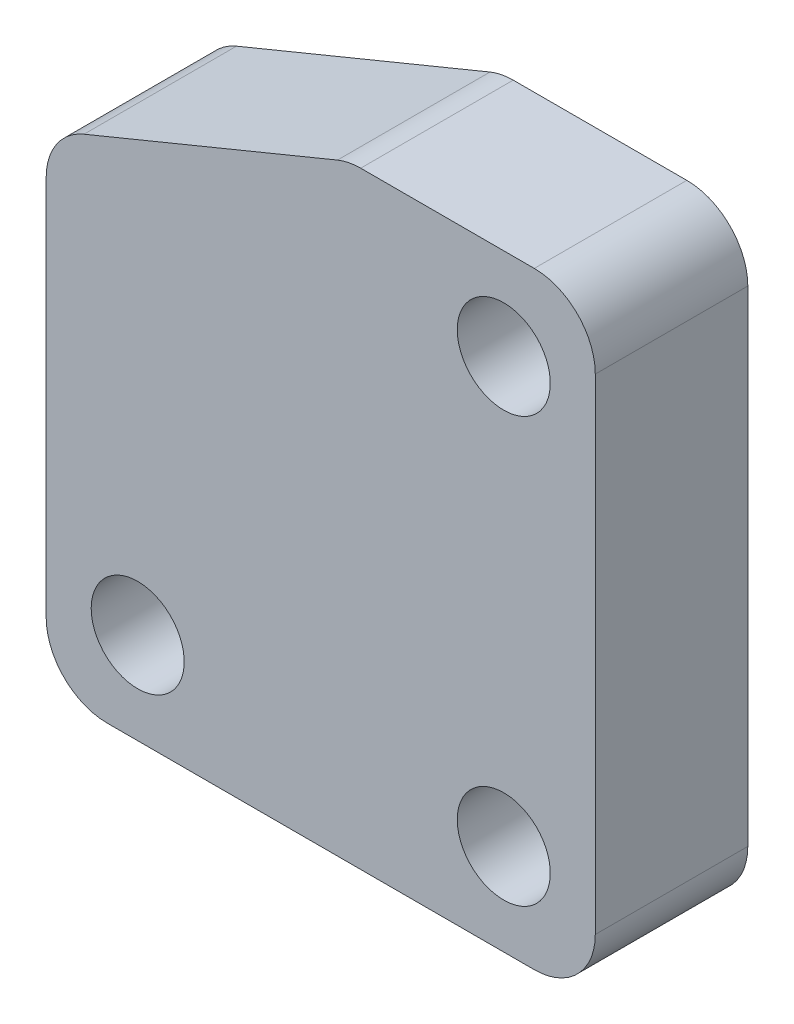
ISO-10303-21;
HEADER;
FILE_DESCRIPTION(('STEP AP214'),'2;1');
FILE_NAME('part.step','',(''),(''),'','','');
FILE_SCHEMA(('AUTOMOTIVE_DESIGN { 1 0 10303 214 1 1 1 1 }'));
ENDSEC;
DATA;
#1=APPLICATION_CONTEXT('core data for automotive mechanical design processes');
#2=APPLICATION_PROTOCOL_DEFINITION('international standard','automotive_design',2000,#1);
#3=PRODUCT_CONTEXT('',#1,'mechanical');
#4=PRODUCT('Part','Part','',(#3));
#5=PRODUCT_RELATED_PRODUCT_CATEGORY('part','',(#4));
#6=PRODUCT_DEFINITION_FORMATION('','',#4);
#7=PRODUCT_DEFINITION_CONTEXT('part definition',#1,'design');
#8=PRODUCT_DEFINITION('design','',#6,#7);
#9=PRODUCT_DEFINITION_SHAPE('','',#8);
#10=(LENGTH_UNIT() NAMED_UNIT(*) SI_UNIT(.MILLI.,.METRE.));
#11=(NAMED_UNIT(*) PLANE_ANGLE_UNIT() SI_UNIT($,.RADIAN.));
#12=(NAMED_UNIT(*) SI_UNIT($,.STERADIAN.) SOLID_ANGLE_UNIT());
#13=UNCERTAINTY_MEASURE_WITH_UNIT(LENGTH_MEASURE(1.E-05),#10,'distance_accuracy_value','');
#14=(GEOMETRIC_REPRESENTATION_CONTEXT(3) GLOBAL_UNCERTAINTY_ASSIGNED_CONTEXT((#13)) GLOBAL_UNIT_ASSIGNED_CONTEXT((#10,
#11,#12)) REPRESENTATION_CONTEXT('',''));
#15=CARTESIAN_POINT('',(0.,0.,0.));
#16=DIRECTION('',(0.,0.,1.));
#17=DIRECTION('',(1.,0.,0.));
#18=AXIS2_PLACEMENT_3D('',#15,#16,#17);
#19=CARTESIAN_POINT('',(0.,0.,5.));
#20=DIRECTION('',(0.,0.,-1.));
#21=DIRECTION('',(-1.,0.,0.));
#22=AXIS2_PLACEMENT_3D('',#19,#20,#21);
#23=PLANE('',#22);
#24=CARTESIAN_POINT('',(45.459966446755,2.13844593334758,5.));
#25=DIRECTION('',(0.,0.,-1.));
#26=DIRECTION('',(-1.,0.,0.));
#27=AXIS2_PLACEMENT_3D('',#24,#25,#26);
#28=CIRCLE('',#27,1.525);
#29=CARTESIAN_POINT('',(43.934966446755,2.13844593334758,5.));
#30=VERTEX_POINT('',#29);
#31=EDGE_CURVE('E211',#30,#30,#28,.F.);
#32=ORIENTED_EDGE('',*,*,#31,.F.);
#33=EDGE_LOOP('',(#32));
#34=FACE_BOUND('',#33,.T.);
#35=CARTESIAN_POINT('',(33.459966446752,-11.7703553435887,5.));
#36=DIRECTION('',(0.,0.,-1.));
#37=DIRECTION('',(-1.,0.,0.));
#38=AXIS2_PLACEMENT_3D('',#35,#36,#37);
#39=CIRCLE('',#38,1.525);
#40=CARTESIAN_POINT('',(31.934966446752,-11.7703553435887,5.));
#41=VERTEX_POINT('',#40);
#42=EDGE_CURVE('E226',#41,#41,#39,.F.);
#43=ORIENTED_EDGE('',*,*,#42,.F.);
#44=EDGE_LOOP('',(#43));
#45=FACE_BOUND('',#44,.T.);
#46=CARTESIAN_POINT('',(45.4599664467526,-11.7703553435908,5.));
#47=DIRECTION('',(0.,0.,-1.));
#48=DIRECTION('',(-1.,0.,0.));
#49=AXIS2_PLACEMENT_3D('',#46,#47,#48);
#50=CIRCLE('',#49,1.525);
#51=CARTESIAN_POINT('',(43.9349664467526,-11.7703553435908,5.));
#52=VERTEX_POINT('',#51);
#53=EDGE_CURVE('E222',#52,#52,#50,.F.);
#54=ORIENTED_EDGE('',*,*,#53,.F.);
#55=EDGE_LOOP('',(#54));
#56=FACE_BOUND('',#55,.T.);
#57=DIRECTION('',(0.,1.,0.));
#58=VECTOR('',#57,1.);
#59=CARTESIAN_POINT('',(48.459966446755,5.13844593334969,5.));
#60=LINE('',#59,#58);
#61=CARTESIAN_POINT('',(48.459966446755,-12.7703553435908,5.));
#62=VERTEX_POINT('',#61);
#63=CARTESIAN_POINT('',(48.459966446755,3.13844593334969,5.));
#64=VERTEX_POINT('',#63);
#65=EDGE_CURVE('E124',#62,#64,#60,.T.);
#66=ORIENTED_EDGE('',*,*,#65,.T.);
#67=CARTESIAN_POINT('',(46.459966446755,3.13844593334969,5.));
#68=DIRECTION('',(0.,0.,-1.));
#69=DIRECTION('',(-1.,0.,0.));
#70=AXIS2_PLACEMENT_3D('',#67,#68,#69);
#71=CIRCLE('',#70,2.);
#72=CARTESIAN_POINT('',(46.459966446755,5.13844593334969,5.));
#73=VERTEX_POINT('',#72);
#74=EDGE_CURVE('E119',#64,#73,#71,.F.);
#75=ORIENTED_EDGE('',*,*,#74,.T.);
#76=DIRECTION('',(-1.,0.,0.));
#77=VECTOR('',#76,1.);
#78=CARTESIAN_POINT('',(30.4599664467545,5.13844593334969,5.));
#79=LINE('',#78,#77);
#80=CARTESIAN_POINT('',(40.7696694782713,5.13844593334969,5.));
#81=VERTEX_POINT('',#80);
#82=EDGE_CURVE('E121',#73,#81,#79,.T.);
#83=ORIENTED_EDGE('',*,*,#82,.T.);
#84=CARTESIAN_POINT('',(40.7696694782713,3.13844593334969,5.));
#85=DIRECTION('',(0.,0.,-1.));
#86=DIRECTION('',(-1.,0.,0.));
#87=AXIS2_PLACEMENT_3D('',#84,#85,#86);
#88=CIRCLE('',#87,2.);
#89=CARTESIAN_POINT('',(40.0084562458271,4.98792002474754,5.));
#90=VERTEX_POINT('',#89);
#91=EDGE_CURVE('E164',#81,#90,#88,.F.);
#92=ORIENTED_EDGE('',*,*,#91,.T.);
#93=DIRECTION('',(0.924737045698927,0.380606616222079,0.));
#94=VECTOR('',#93,1.);
#95=CARTESIAN_POINT('',(25.4599664467544,-1.00000000000001,5.));
#96=LINE('',#95,#94);
#97=CARTESIAN_POINT('',(31.6987532143079,1.56778241119875,5.));
#98=VERTEX_POINT('',#97);
#99=EDGE_CURVE('E181',#98,#90,#96,.T.);
#100=ORIENTED_EDGE('',*,*,#99,.F.);
#101=CARTESIAN_POINT('',(32.459966446752,-0.281691680199106,5.));
#102=DIRECTION('',(0.,0.,-1.));
#103=DIRECTION('',(-1.,0.,0.));
#104=AXIS2_PLACEMENT_3D('',#101,#102,#103);
#105=CIRCLE('',#104,2.);
#106=CARTESIAN_POINT('',(30.459966446752,-0.281691680199106,5.));
#107=VERTEX_POINT('',#106);
#108=EDGE_CURVE('E162',#98,#107,#105,.F.);
#109=ORIENTED_EDGE('',*,*,#108,.T.);
#110=DIRECTION('',(0.,1.,0.));
#111=VECTOR('',#110,1.);
#112=CARTESIAN_POINT('',(30.459966446752,-14.7703553435908,5.));
#113=LINE('',#112,#111);
#114=CARTESIAN_POINT('',(30.459966446752,-12.7703553435908,5.));
#115=VERTEX_POINT('',#114);
#116=EDGE_CURVE('E147',#115,#107,#113,.T.);
#117=ORIENTED_EDGE('',*,*,#116,.F.);
#118=CARTESIAN_POINT('',(32.459966446752,-12.7703553435908,5.));
#119=DIRECTION('',(0.,0.,-1.));
#120=DIRECTION('',(-1.,0.,0.));
#121=AXIS2_PLACEMENT_3D('',#118,#119,#120);
#122=CIRCLE('',#121,2.);
#123=CARTESIAN_POINT('',(32.459966446752,-14.7703553435908,5.));
#124=VERTEX_POINT('',#123);
#125=EDGE_CURVE('E62',#115,#124,#122,.F.);
#126=ORIENTED_EDGE('',*,*,#125,.T.);
#127=DIRECTION('',(1.,0.,0.));
#128=VECTOR('',#127,1.);
#129=CARTESIAN_POINT('',(30.459966446752,-14.7703553435908,5.));
#130=LINE('',#129,#128);
#131=CARTESIAN_POINT('',(46.459966446755,-14.7703553435908,5.));
#132=VERTEX_POINT('',#131);
#133=EDGE_CURVE('E209',#124,#132,#130,.T.);
#134=ORIENTED_EDGE('',*,*,#133,.T.);
#135=CARTESIAN_POINT('',(46.459966446755,-12.7703553435908,5.));
#136=DIRECTION('',(0.,0.,-1.));
#137=DIRECTION('',(-1.,0.,0.));
#138=AXIS2_PLACEMENT_3D('',#135,#136,#137);
#139=CIRCLE('',#138,2.);
#140=EDGE_CURVE('E129',#132,#62,#139,.F.);
#141=ORIENTED_EDGE('',*,*,#140,.T.);
#142=EDGE_LOOP('',(#66,#75,#83,#92,#100,#109,#117,#126,#134,#141));
#143=FACE_BOUND('',#142,.T.);
#144=ADVANCED_FACE('F40',(#34,#45,#56,#143),#23,.F.);
#145=CARTESIAN_POINT('',(0.,0.,0.));
#146=DIRECTION('',(0.,0.,-1.));
#147=DIRECTION('',(-1.,0.,0.));
#148=AXIS2_PLACEMENT_3D('',#145,#146,#147);
#149=PLANE('',#148);
#150=DIRECTION('',(1.,0.,0.));
#151=VECTOR('',#150,1.);
#152=CARTESIAN_POINT('',(30.4599664467545,5.13844593334969,0.));
#153=LINE('',#152,#151);
#154=CARTESIAN_POINT('',(40.7696694782713,5.13844593334969,0.));
#155=VERTEX_POINT('',#154);
#156=CARTESIAN_POINT('',(46.459966446755,5.13844593334969,0.));
#157=VERTEX_POINT('',#156);
#158=EDGE_CURVE('E139',#155,#157,#153,.T.);
#159=ORIENTED_EDGE('',*,*,#158,.T.);
#160=CARTESIAN_POINT('',(46.459966446755,3.13844593334969,0.));
#161=DIRECTION('',(0.,0.,-1.));
#162=DIRECTION('',(-1.,0.,0.));
#163=AXIS2_PLACEMENT_3D('',#160,#161,#162);
#164=CIRCLE('',#163,2.);
#165=CARTESIAN_POINT('',(48.459966446755,3.13844593334969,0.));
#166=VERTEX_POINT('',#165);
#167=EDGE_CURVE('E142',#157,#166,#164,.T.);
#168=ORIENTED_EDGE('',*,*,#167,.T.);
#169=DIRECTION('',(0.,-1.,0.));
#170=VECTOR('',#169,1.);
#171=CARTESIAN_POINT('',(48.459966446755,5.13844593334969,0.));
#172=LINE('',#171,#170);
#173=CARTESIAN_POINT('',(48.459966446755,-12.7703553435908,0.));
#174=VERTEX_POINT('',#173);
#175=EDGE_CURVE('E212',#166,#174,#172,.T.);
#176=ORIENTED_EDGE('',*,*,#175,.T.);
#177=CARTESIAN_POINT('',(46.459966446755,-12.7703553435908,0.));
#178=DIRECTION('',(0.,0.,-1.));
#179=DIRECTION('',(-1.,0.,0.));
#180=AXIS2_PLACEMENT_3D('',#177,#178,#179);
#181=CIRCLE('',#180,2.);
#182=CARTESIAN_POINT('',(46.459966446755,-14.7703553435908,0.));
#183=VERTEX_POINT('',#182);
#184=EDGE_CURVE('E154',#174,#183,#181,.T.);
#185=ORIENTED_EDGE('',*,*,#184,.T.);
#186=DIRECTION('',(-1.,0.,0.));
#187=VECTOR('',#186,1.);
#188=CARTESIAN_POINT('',(30.459966446752,-14.7703553435908,0.));
#189=LINE('',#188,#187);
#190=CARTESIAN_POINT('',(32.459966446752,-14.7703553435908,0.));
#191=VERTEX_POINT('',#190);
#192=EDGE_CURVE('E208',#183,#191,#189,.T.);
#193=ORIENTED_EDGE('',*,*,#192,.T.);
#194=CARTESIAN_POINT('',(32.459966446752,-12.7703553435908,0.));
#195=DIRECTION('',(0.,0.,-1.));
#196=DIRECTION('',(-1.,0.,0.));
#197=AXIS2_PLACEMENT_3D('',#194,#195,#196);
#198=CIRCLE('',#197,2.);
#199=CARTESIAN_POINT('',(30.459966446752,-12.7703553435908,0.));
#200=VERTEX_POINT('',#199);
#201=EDGE_CURVE('E152',#191,#200,#198,.T.);
#202=ORIENTED_EDGE('',*,*,#201,.T.);
#203=DIRECTION('',(0.,-1.,0.));
#204=VECTOR('',#203,1.);
#205=CARTESIAN_POINT('',(30.459966446752,-14.7703553435908,0.));
#206=LINE('',#205,#204);
#207=CARTESIAN_POINT('',(30.459966446752,-0.281691680199106,0.));
#208=VERTEX_POINT('',#207);
#209=EDGE_CURVE('E188',#208,#200,#206,.T.);
#210=ORIENTED_EDGE('',*,*,#209,.F.);
#211=CARTESIAN_POINT('',(32.459966446752,-0.281691680199106,0.));
#212=DIRECTION('',(0.,0.,-1.));
#213=DIRECTION('',(-1.,0.,0.));
#214=AXIS2_PLACEMENT_3D('',#211,#212,#213);
#215=CIRCLE('',#214,2.);
#216=CARTESIAN_POINT('',(31.6987532143079,1.56778241119875,0.));
#217=VERTEX_POINT('',#216);
#218=EDGE_CURVE('E143',#208,#217,#215,.T.);
#219=ORIENTED_EDGE('',*,*,#218,.T.);
#220=DIRECTION('',(-0.924737045698927,-0.380606616222079,0.));
#221=VECTOR('',#220,1.);
#222=CARTESIAN_POINT('',(25.4599664467544,-1.00000000000001,0.));
#223=LINE('',#222,#221);
#224=CARTESIAN_POINT('',(40.0084562458271,4.98792002474754,0.));
#225=VERTEX_POINT('',#224);
#226=EDGE_CURVE('E184',#225,#217,#223,.T.);
#227=ORIENTED_EDGE('',*,*,#226,.F.);
#228=CARTESIAN_POINT('',(40.7696694782713,3.13844593334969,0.));
#229=DIRECTION('',(0.,0.,-1.));
#230=DIRECTION('',(-1.,0.,0.));
#231=AXIS2_PLACEMENT_3D('',#228,#229,#230);
#232=CIRCLE('',#231,2.);
#233=EDGE_CURVE('E145',#225,#155,#232,.T.);
#234=ORIENTED_EDGE('',*,*,#233,.T.);
#235=EDGE_LOOP('',(#159,#168,#176,#185,#193,#202,#210,#219,#227,#234));
#236=FACE_BOUND('',#235,.T.);
#237=CARTESIAN_POINT('',(33.459966446752,-11.7703553435887,0.));
#238=DIRECTION('',(0.,0.,-1.));
#239=DIRECTION('',(-1.,0.,0.));
#240=AXIS2_PLACEMENT_3D('',#237,#238,#239);
#241=CIRCLE('',#240,1.525);
#242=CARTESIAN_POINT('',(31.934966446752,-11.7703553435887,0.));
#243=VERTEX_POINT('',#242);
#244=EDGE_CURVE('E192',#243,#243,#241,.T.);
#245=ORIENTED_EDGE('',*,*,#244,.F.);
#246=EDGE_LOOP('',(#245));
#247=FACE_BOUND('',#246,.T.);
#248=CARTESIAN_POINT('',(45.4599664467526,-11.7703553435908,0.));
#249=DIRECTION('',(0.,0.,-1.));
#250=DIRECTION('',(-1.,0.,0.));
#251=AXIS2_PLACEMENT_3D('',#248,#249,#250);
#252=CIRCLE('',#251,1.525);
#253=CARTESIAN_POINT('',(43.9349664467526,-11.7703553435908,0.));
#254=VERTEX_POINT('',#253);
#255=EDGE_CURVE('E223',#254,#254,#252,.T.);
#256=ORIENTED_EDGE('',*,*,#255,.F.);
#257=EDGE_LOOP('',(#256));
#258=FACE_BOUND('',#257,.T.);
#259=CARTESIAN_POINT('',(45.459966446755,2.13844593334758,0.));
#260=DIRECTION('',(0.,0.,-1.));
#261=DIRECTION('',(-1.,0.,0.));
#262=AXIS2_PLACEMENT_3D('',#259,#260,#261);
#263=CIRCLE('',#262,1.525);
#264=CARTESIAN_POINT('',(43.934966446755,2.13844593334758,0.));
#265=VERTEX_POINT('',#264);
#266=EDGE_CURVE('E215',#265,#265,#263,.T.);
#267=ORIENTED_EDGE('',*,*,#266,.F.);
#268=EDGE_LOOP('',(#267));
#269=FACE_BOUND('',#268,.T.);
#270=ADVANCED_FACE('F201',(#236,#247,#258,#269),#149,.T.);
#271=CARTESIAN_POINT('',(30.4599664467545,5.13844593334969,51.8957260200146));
#272=DIRECTION('',(0.,1.,0.));
#273=DIRECTION('',(-1.,0.,0.));
#274=AXIS2_PLACEMENT_3D('',#271,#272,#273);
#275=PLANE('',#274);
#276=ORIENTED_EDGE('',*,*,#82,.F.);
#277=DIRECTION('',(0.,0.,-1.));
#278=VECTOR('',#277,1.);
#279=CARTESIAN_POINT('',(46.459966446755,5.13844593334969,51.8957260200146));
#280=LINE('',#279,#278);
#281=EDGE_CURVE('E135',#73,#157,#280,.T.);
#282=ORIENTED_EDGE('',*,*,#281,.T.);
#283=ORIENTED_EDGE('',*,*,#158,.F.);
#284=DIRECTION('',(0.,0.,-1.));
#285=VECTOR('',#284,1.);
#286=CARTESIAN_POINT('',(40.7696694782713,5.13844593334969,5.00000000000001));
#287=LINE('',#286,#285);
#288=EDGE_CURVE('E138',#155,#81,#287,.F.);
#289=ORIENTED_EDGE('',*,*,#288,.T.);
#290=EDGE_LOOP('',(#276,#282,#283,#289));
#291=FACE_BOUND('',#290,.T.);
#292=ADVANCED_FACE('F133',(#291),#275,.T.);
#293=CARTESIAN_POINT('',(48.459966446755,5.13844593334969,51.8957260200146));
#294=DIRECTION('',(1.,0.,0.));
#295=DIRECTION('',(0.,0.,-1.));
#296=AXIS2_PLACEMENT_3D('',#293,#294,#295);
#297=PLANE('',#296);
#298=ORIENTED_EDGE('',*,*,#175,.F.);
#299=DIRECTION('',(0.,0.,-1.));
#300=VECTOR('',#299,1.);
#301=CARTESIAN_POINT('',(48.459966446755,3.13844593334969,51.8957260200146));
#302=LINE('',#301,#300);
#303=EDGE_CURVE('E160',#166,#64,#302,.F.);
#304=ORIENTED_EDGE('',*,*,#303,.T.);
#305=ORIENTED_EDGE('',*,*,#65,.F.);
#306=DIRECTION('',(0.,0.,-1.));
#307=VECTOR('',#306,1.);
#308=CARTESIAN_POINT('',(48.459966446755,-12.7703553435908,51.8957260200146));
#309=LINE('',#308,#307);
#310=EDGE_CURVE('E157',#62,#174,#309,.T.);
#311=ORIENTED_EDGE('',*,*,#310,.T.);
#312=EDGE_LOOP('',(#298,#304,#305,#311));
#313=FACE_BOUND('',#312,.T.);
#314=ADVANCED_FACE('F262',(#313),#297,.T.);
#315=CARTESIAN_POINT('',(30.459966446752,-14.7703553435908,51.8957260200146));
#316=DIRECTION('',(0.,-1.,0.));
#317=DIRECTION('',(1.,0.,0.));
#318=AXIS2_PLACEMENT_3D('',#315,#316,#317);
#319=PLANE('',#318);
#320=ORIENTED_EDGE('',*,*,#192,.F.);
#321=DIRECTION('',(0.,0.,-1.));
#322=VECTOR('',#321,1.);
#323=CARTESIAN_POINT('',(46.459966446755,-14.7703553435908,51.8957260200146));
#324=LINE('',#323,#322);
#325=EDGE_CURVE('E55',#183,#132,#324,.F.);
#326=ORIENTED_EDGE('',*,*,#325,.T.);
#327=ORIENTED_EDGE('',*,*,#133,.F.);
#328=DIRECTION('',(0.,0.,-1.));
#329=VECTOR('',#328,1.);
#330=CARTESIAN_POINT('',(32.459966446752,-14.7703553435908,0.));
#331=LINE('',#330,#329);
#332=EDGE_CURVE('E128',#124,#191,#331,.T.);
#333=ORIENTED_EDGE('',*,*,#332,.T.);
#334=EDGE_LOOP('',(#320,#326,#327,#333));
#335=FACE_BOUND('',#334,.T.);
#336=ADVANCED_FACE('F207',(#335),#319,.T.);
#337=CARTESIAN_POINT('',(45.459966446755,2.13844593334758,51.8957260200146));
#338=DIRECTION('',(0.,0.,-1.));
#339=DIRECTION('',(-1.,0.,0.));
#340=AXIS2_PLACEMENT_3D('',#337,#338,#339);
#341=CYLINDRICAL_SURFACE('',#340,1.525);
#342=ORIENTED_EDGE('',*,*,#31,.T.);
#343=EDGE_LOOP('',(#342));
#344=FACE_BOUND('',#343,.T.);
#345=ORIENTED_EDGE('',*,*,#266,.T.);
#346=EDGE_LOOP('',(#345));
#347=FACE_BOUND('',#346,.T.);
#348=ADVANCED_FACE('F247',(#344,#347),#341,.F.);
#349=CARTESIAN_POINT('',(45.4599664467526,-11.7703553435908,51.8957260200146));
#350=DIRECTION('',(0.,0.,-1.));
#351=DIRECTION('',(-1.,0.,0.));
#352=AXIS2_PLACEMENT_3D('',#349,#350,#351);
#353=CYLINDRICAL_SURFACE('',#352,1.525);
#354=ORIENTED_EDGE('',*,*,#53,.T.);
#355=EDGE_LOOP('',(#354));
#356=FACE_BOUND('',#355,.T.);
#357=ORIENTED_EDGE('',*,*,#255,.T.);
#358=EDGE_LOOP('',(#357));
#359=FACE_BOUND('',#358,.T.);
#360=ADVANCED_FACE('F244',(#356,#359),#353,.F.);
#361=CARTESIAN_POINT('',(33.459966446752,-11.7703553435887,51.8957260200146));
#362=DIRECTION('',(0.,0.,-1.));
#363=DIRECTION('',(-1.,0.,0.));
#364=AXIS2_PLACEMENT_3D('',#361,#362,#363);
#365=CYLINDRICAL_SURFACE('',#364,1.525);
#366=ORIENTED_EDGE('',*,*,#42,.T.);
#367=EDGE_LOOP('',(#366));
#368=FACE_BOUND('',#367,.T.);
#369=ORIENTED_EDGE('',*,*,#244,.T.);
#370=EDGE_LOOP('',(#369));
#371=FACE_BOUND('',#370,.T.);
#372=ADVANCED_FACE('F235',(#368,#371),#365,.F.);
#373=CARTESIAN_POINT('',(25.4599664467544,-1.00000000000001,21.1280589241465));
#374=DIRECTION('',(0.380606616222079,-0.924737045698927,0.));
#375=DIRECTION('',(0.924737045698927,0.380606616222079,0.));
#376=AXIS2_PLACEMENT_3D('',#373,#374,#375);
#377=PLANE('',#376);
#378=ORIENTED_EDGE('',*,*,#99,.T.);
#379=DIRECTION('',(0.,0.,-1.));
#380=VECTOR('',#379,1.);
#381=CARTESIAN_POINT('',(40.0084562458271,4.98792002474754,0.));
#382=LINE('',#381,#380);
#383=EDGE_CURVE('E11',#90,#225,#382,.T.);
#384=ORIENTED_EDGE('',*,*,#383,.T.);
#385=ORIENTED_EDGE('',*,*,#226,.T.);
#386=DIRECTION('',(0.,0.,1.));
#387=VECTOR('',#386,1.);
#388=CARTESIAN_POINT('',(31.6987532143079,1.56778241119875,21.1280589241465));
#389=LINE('',#388,#387);
#390=EDGE_CURVE('E48',#217,#98,#389,.T.);
#391=ORIENTED_EDGE('',*,*,#390,.T.);
#392=EDGE_LOOP('',(#378,#384,#385,#391));
#393=FACE_BOUND('',#392,.T.);
#394=ADVANCED_FACE('F180',(#393),#377,.F.);
#395=CARTESIAN_POINT('',(30.459966446752,-14.7703553435908,46.2310562561766));
#396=DIRECTION('',(1.,0.,0.));
#397=DIRECTION('',(0.,0.,-1.));
#398=AXIS2_PLACEMENT_3D('',#395,#396,#397);
#399=PLANE('',#398);
#400=ORIENTED_EDGE('',*,*,#209,.T.);
#401=DIRECTION('',(0.,0.,-1.));
#402=VECTOR('',#401,1.);
#403=CARTESIAN_POINT('',(30.459966446752,-12.7703553435908,5.));
#404=LINE('',#403,#402);
#405=EDGE_CURVE('E173',#200,#115,#404,.F.);
#406=ORIENTED_EDGE('',*,*,#405,.T.);
#407=ORIENTED_EDGE('',*,*,#116,.T.);
#408=DIRECTION('',(0.,0.,1.));
#409=VECTOR('',#408,1.);
#410=CARTESIAN_POINT('',(30.459966446752,-0.281691680199106,46.2310562561766));
#411=LINE('',#410,#409);
#412=EDGE_CURVE('E171',#107,#208,#411,.F.);
#413=ORIENTED_EDGE('',*,*,#412,.T.);
#414=EDGE_LOOP('',(#400,#406,#407,#413));
#415=FACE_BOUND('',#414,.T.);
#416=ADVANCED_FACE('F197',(#415),#399,.F.);
#417=CARTESIAN_POINT('',(46.459966446755,3.13844593334969,51.8957260200146));
#418=DIRECTION('',(0.,0.,-1.));
#419=DIRECTION('',(-1.,0.,0.));
#420=AXIS2_PLACEMENT_3D('',#417,#418,#419);
#421=CYLINDRICAL_SURFACE('',#420,2.);
#422=ORIENTED_EDGE('',*,*,#74,.F.);
#423=ORIENTED_EDGE('',*,*,#303,.F.);
#424=ORIENTED_EDGE('',*,*,#167,.F.);
#425=ORIENTED_EDGE('',*,*,#281,.F.);
#426=EDGE_LOOP('',(#422,#423,#424,#425));
#427=FACE_BOUND('',#426,.T.);
#428=ADVANCED_FACE('F141',(#427),#421,.T.);
#429=CARTESIAN_POINT('',(46.459966446755,-12.7703553435908,51.8957260200146));
#430=DIRECTION('',(0.,0.,-1.));
#431=DIRECTION('',(-1.,0.,0.));
#432=AXIS2_PLACEMENT_3D('',#429,#430,#431);
#433=CYLINDRICAL_SURFACE('',#432,2.);
#434=ORIENTED_EDGE('',*,*,#140,.F.);
#435=ORIENTED_EDGE('',*,*,#325,.F.);
#436=ORIENTED_EDGE('',*,*,#184,.F.);
#437=ORIENTED_EDGE('',*,*,#310,.F.);
#438=EDGE_LOOP('',(#434,#435,#436,#437));
#439=FACE_BOUND('',#438,.T.);
#440=ADVANCED_FACE('F274',(#439),#433,.T.);
#441=CARTESIAN_POINT('',(32.459966446752,-12.7703553435908,51.8957260200146));
#442=DIRECTION('',(0.,0.,1.));
#443=DIRECTION('',(1.,0.,0.));
#444=AXIS2_PLACEMENT_3D('',#441,#442,#443);
#445=CYLINDRICAL_SURFACE('',#444,2.);
#446=ORIENTED_EDGE('',*,*,#125,.F.);
#447=ORIENTED_EDGE('',*,*,#405,.F.);
#448=ORIENTED_EDGE('',*,*,#201,.F.);
#449=ORIENTED_EDGE('',*,*,#332,.F.);
#450=EDGE_LOOP('',(#446,#447,#448,#449));
#451=FACE_BOUND('',#450,.T.);
#452=ADVANCED_FACE('F205',(#451),#445,.T.);
#453=CARTESIAN_POINT('',(40.7696694782713,3.13844593334969,21.1280589241465));
#454=DIRECTION('',(0.,0.,1.));
#455=DIRECTION('',(1.,0.,0.));
#456=AXIS2_PLACEMENT_3D('',#453,#454,#455);
#457=CYLINDRICAL_SURFACE('',#456,2.);
#458=ORIENTED_EDGE('',*,*,#91,.F.);
#459=ORIENTED_EDGE('',*,*,#288,.F.);
#460=ORIENTED_EDGE('',*,*,#233,.F.);
#461=ORIENTED_EDGE('',*,*,#383,.F.);
#462=EDGE_LOOP('',(#458,#459,#460,#461));
#463=FACE_BOUND('',#462,.T.);
#464=ADVANCED_FACE('F279',(#463),#457,.T.);
#465=CARTESIAN_POINT('',(32.459966446752,-0.281691680199106,21.1280589241465));
#466=DIRECTION('',(0.,0.,1.));
#467=DIRECTION('',(1.,0.,0.));
#468=AXIS2_PLACEMENT_3D('',#465,#466,#467);
#469=CYLINDRICAL_SURFACE('',#468,2.);
#470=ORIENTED_EDGE('',*,*,#218,.F.);
#471=ORIENTED_EDGE('',*,*,#412,.F.);
#472=ORIENTED_EDGE('',*,*,#108,.F.);
#473=ORIENTED_EDGE('',*,*,#390,.F.);
#474=EDGE_LOOP('',(#470,#471,#472,#473));
#475=FACE_BOUND('',#474,.T.);
#476=ADVANCED_FACE('F42',(#475),#469,.T.);
#477=CLOSED_SHELL('',(#144,#270,#292,#314,#336,#348,#360,#372,#394,#416,#428,#440,#452,#464,#476));
#478=MANIFOLD_SOLID_BREP('B2',#477);
#479=ADVANCED_BREP_SHAPE_REPRESENTATION('',(#18,#478),#14);
#480=SHAPE_DEFINITION_REPRESENTATION(#9,#479);
ENDSEC;
END-ISO-10303-21;
